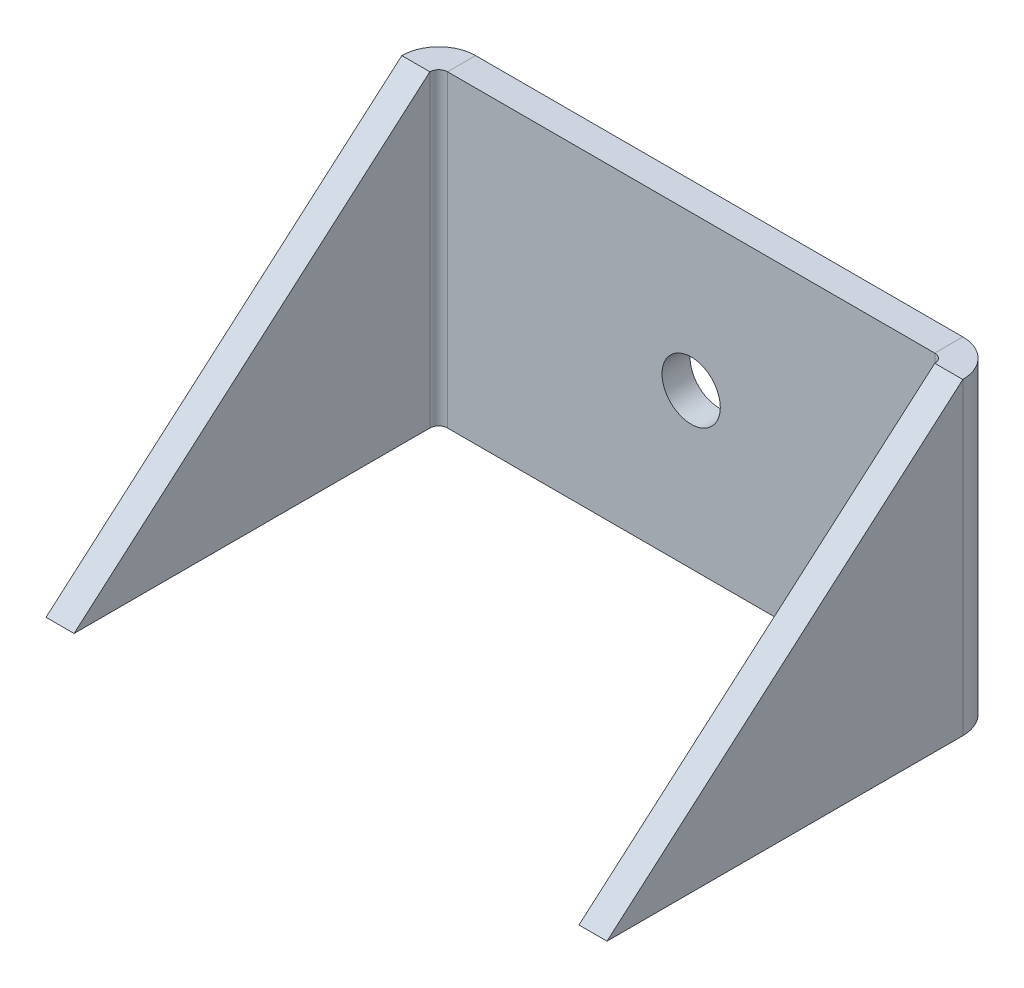
ISO-10303-21;
HEADER;
FILE_DESCRIPTION(('STEP AP214'),'2;1');
FILE_NAME('part.step','',(''),(''),'','','');
FILE_SCHEMA(('AUTOMOTIVE_DESIGN { 1 0 10303 214 1 1 1 1 }'));
ENDSEC;
DATA;
#1=APPLICATION_CONTEXT('core data for automotive mechanical design processes');
#2=APPLICATION_PROTOCOL_DEFINITION('international standard','automotive_design',2000,#1);
#3=PRODUCT_CONTEXT('',#1,'mechanical');
#4=PRODUCT('Part','Part','',(#3));
#5=PRODUCT_RELATED_PRODUCT_CATEGORY('part','',(#4));
#6=PRODUCT_DEFINITION_FORMATION('','',#4);
#7=PRODUCT_DEFINITION_CONTEXT('part definition',#1,'design');
#8=PRODUCT_DEFINITION('design','',#6,#7);
#9=PRODUCT_DEFINITION_SHAPE('','',#8);
#10=(LENGTH_UNIT() NAMED_UNIT(*) SI_UNIT(.MILLI.,.METRE.));
#11=(NAMED_UNIT(*) PLANE_ANGLE_UNIT() SI_UNIT($,.RADIAN.));
#12=(NAMED_UNIT(*) SI_UNIT($,.STERADIAN.) SOLID_ANGLE_UNIT());
#13=UNCERTAINTY_MEASURE_WITH_UNIT(LENGTH_MEASURE(1.E-05),#10,'distance_accuracy_value','');
#14=(GEOMETRIC_REPRESENTATION_CONTEXT(3) GLOBAL_UNCERTAINTY_ASSIGNED_CONTEXT((#13)) GLOBAL_UNIT_ASSIGNED_CONTEXT((#10,
#11,#12)) REPRESENTATION_CONTEXT('',''));
#15=CARTESIAN_POINT('',(0.,0.,0.));
#16=DIRECTION('',(0.,0.,1.));
#17=DIRECTION('',(1.,0.,0.));
#18=AXIS2_PLACEMENT_3D('',#15,#16,#17);
#19=CARTESIAN_POINT('',(-31.75,0.,-1.11966295392247E-13));
#20=DIRECTION('',(1.,0.,0.));
#21=DIRECTION('',(0.,0.,1.));
#22=AXIS2_PLACEMENT_3D('',#19,#20,#21);
#23=PLANE('',#22);
#24=DIRECTION('',(0.,0.655144760280018,-0.755503370659349));
#25=VECTOR('',#24,1.);
#26=CARTESIAN_POINT('',(-31.75,17.4625,4.17499999999998));
#27=LINE('',#26,#25);
#28=CARTESIAN_POINT('',(-31.7500000000001,-17.4625,44.45));
#29=VERTEX_POINT('',#28);
#30=CARTESIAN_POINT('',(-31.75,17.4625,4.17499999999998));
#31=VERTEX_POINT('',#30);
#32=EDGE_CURVE('E125',#29,#31,#27,.T.);
#33=ORIENTED_EDGE('',*,*,#32,.T.);
#34=DIRECTION('',(0.,1.,0.));
#35=VECTOR('',#34,1.);
#36=CARTESIAN_POINT('',(-31.75,0.,4.17499999999998));
#37=LINE('',#36,#35);
#38=CARTESIAN_POINT('',(-31.75,-17.4625,4.17499999999999));
#39=VERTEX_POINT('',#38);
#40=EDGE_CURVE('E148',#39,#31,#37,.T.);
#41=ORIENTED_EDGE('',*,*,#40,.F.);
#42=DIRECTION('',(0.,0.,-1.));
#43=VECTOR('',#42,1.);
#44=CARTESIAN_POINT('',(-31.75,-17.4625,3.17499999999999));
#45=LINE('',#44,#43);
#46=EDGE_CURVE('E154',#29,#39,#45,.T.);
#47=ORIENTED_EDGE('',*,*,#46,.F.);
#48=EDGE_LOOP('',(#33,#41,#47));
#49=FACE_BOUND('',#48,.T.);
#50=ADVANCED_FACE('F35',(#49),#23,.F.);
#51=CARTESIAN_POINT('',(-28.575,0.,-1.0088084214142E-13));
#52=DIRECTION('',(1.,0.,0.));
#53=DIRECTION('',(0.,0.,1.));
#54=AXIS2_PLACEMENT_3D('',#51,#52,#53);
#55=PLANE('',#54);
#56=DIRECTION('',(0.,-1.,0.));
#57=VECTOR('',#56,1.);
#58=CARTESIAN_POINT('',(-28.575,17.4625,4.17499999999999));
#59=LINE('',#58,#57);
#60=CARTESIAN_POINT('',(-28.575,17.4625,4.17499999999999));
#61=VERTEX_POINT('',#60);
#62=CARTESIAN_POINT('',(-28.575,-17.4625,4.175));
#63=VERTEX_POINT('',#62);
#64=EDGE_CURVE('E135',#61,#63,#59,.T.);
#65=ORIENTED_EDGE('',*,*,#64,.F.);
#66=DIRECTION('',(0.,0.655144760280018,-0.755503370659349));
#67=VECTOR('',#66,1.);
#68=CARTESIAN_POINT('',(-28.575,17.4625,4.17499999999999));
#69=LINE('',#68,#67);
#70=CARTESIAN_POINT('',(-28.5750000000001,-17.4625,44.45));
#71=VERTEX_POINT('',#70);
#72=EDGE_CURVE('E114',#71,#61,#69,.T.);
#73=ORIENTED_EDGE('',*,*,#72,.F.);
#74=DIRECTION('',(0.,0.,-1.));
#75=VECTOR('',#74,1.);
#76=CARTESIAN_POINT('',(-28.575,-17.4625,3.175));
#77=LINE('',#76,#75);
#78=EDGE_CURVE('E144',#71,#63,#77,.T.);
#79=ORIENTED_EDGE('',*,*,#78,.T.);
#80=EDGE_LOOP('',(#65,#73,#79));
#81=FACE_BOUND('',#80,.T.);
#82=ADVANCED_FACE('F143',(#81),#55,.T.);
#83=CARTESIAN_POINT('',(-28.575,17.4625,3.175));
#84=DIRECTION('',(0.,-1.,0.));
#85=DIRECTION('',(0.,0.,-1.));
#86=AXIS2_PLACEMENT_3D('',#83,#84,#85);
#87=PLANE('',#86);
#88=DIRECTION('',(0.,0.,-1.));
#89=VECTOR('',#88,1.);
#90=CARTESIAN_POINT('',(-27.575,17.4625,3.175));
#91=LINE('',#90,#89);
#92=CARTESIAN_POINT('',(-27.575,17.4625,3.175));
#93=VERTEX_POINT('',#92);
#94=CARTESIAN_POINT('',(-27.575,17.4625,0.));
#95=VERTEX_POINT('',#94);
#96=EDGE_CURVE('E52',#93,#95,#91,.T.);
#97=ORIENTED_EDGE('',*,*,#96,.F.);
#98=DIRECTION('',(-1.,0.,0.));
#99=VECTOR('',#98,1.);
#100=CARTESIAN_POINT('',(-28.575,17.4625,3.175));
#101=LINE('',#100,#99);
#102=CARTESIAN_POINT('',(27.575,17.4625,3.175));
#103=VERTEX_POINT('',#102);
#104=EDGE_CURVE('E44',#103,#93,#101,.T.);
#105=ORIENTED_EDGE('',*,*,#104,.F.);
#106=DIRECTION('',(0.,0.,-1.));
#107=VECTOR('',#106,1.);
#108=CARTESIAN_POINT('',(27.575,17.4625,3.17499999999999));
#109=LINE('',#108,#107);
#110=CARTESIAN_POINT('',(27.575,17.4625,0.));
#111=VERTEX_POINT('',#110);
#112=EDGE_CURVE('E203',#103,#111,#109,.T.);
#113=ORIENTED_EDGE('',*,*,#112,.T.);
#114=DIRECTION('',(-1.,0.,0.));
#115=VECTOR('',#114,1.);
#116=CARTESIAN_POINT('',(-28.575,17.4625,0.));
#117=LINE('',#116,#115);
#118=EDGE_CURVE('E217',#111,#95,#117,.T.);
#119=ORIENTED_EDGE('',*,*,#118,.T.);
#120=EDGE_LOOP('',(#97,#105,#113,#119));
#121=FACE_BOUND('',#120,.T.);
#122=ADVANCED_FACE('F37',(#121),#87,.F.);
#123=CARTESIAN_POINT('',(-28.575,-17.4625,3.175));
#124=DIRECTION('',(0.,1.,0.));
#125=DIRECTION('',(0.,0.,1.));
#126=AXIS2_PLACEMENT_3D('',#123,#124,#125);
#127=PLANE('',#126);
#128=DIRECTION('',(0.,0.,-1.));
#129=VECTOR('',#128,1.);
#130=CARTESIAN_POINT('',(-27.575,-17.4625,3.175));
#131=LINE('',#130,#129);
#132=CARTESIAN_POINT('',(-27.575,-17.4625,3.175));
#133=VERTEX_POINT('',#132);
#134=CARTESIAN_POINT('',(-27.575,-17.4625,0.));
#135=VERTEX_POINT('',#134);
#136=EDGE_CURVE('E163',#133,#135,#131,.T.);
#137=ORIENTED_EDGE('',*,*,#136,.T.);
#138=DIRECTION('',(1.,0.,0.));
#139=VECTOR('',#138,1.);
#140=CARTESIAN_POINT('',(-28.575,-17.4625,0.));
#141=LINE('',#140,#139);
#142=CARTESIAN_POINT('',(27.575,-17.4625,0.));
#143=VERTEX_POINT('',#142);
#144=EDGE_CURVE('E39',#135,#143,#141,.T.);
#145=ORIENTED_EDGE('',*,*,#144,.T.);
#146=DIRECTION('',(0.,0.,-1.));
#147=VECTOR('',#146,1.);
#148=CARTESIAN_POINT('',(27.575,-17.4625,3.17499999999999));
#149=LINE('',#148,#147);
#150=CARTESIAN_POINT('',(27.575,-17.4625,3.175));
#151=VERTEX_POINT('',#150);
#152=EDGE_CURVE('E214',#151,#143,#149,.T.);
#153=ORIENTED_EDGE('',*,*,#152,.F.);
#154=DIRECTION('',(1.,0.,0.));
#155=VECTOR('',#154,1.);
#156=CARTESIAN_POINT('',(-28.575,-17.4625,3.175));
#157=LINE('',#156,#155);
#158=EDGE_CURVE('E11',#133,#151,#157,.T.);
#159=ORIENTED_EDGE('',*,*,#158,.F.);
#160=EDGE_LOOP('',(#137,#145,#153,#159));
#161=FACE_BOUND('',#160,.T.);
#162=ADVANCED_FACE('F223',(#161),#127,.F.);
#163=CARTESIAN_POINT('',(0.,0.,3.175));
#164=DIRECTION('',(0.,0.,1.));
#165=DIRECTION('',(1.,0.,0.));
#166=AXIS2_PLACEMENT_3D('',#163,#164,#165);
#167=PLANE('',#166);
#168=CARTESIAN_POINT('',(0.,0.,3.175));
#169=DIRECTION('',(0.,0.,1.));
#170=DIRECTION('',(1.,0.,0.));
#171=AXIS2_PLACEMENT_3D('',#168,#169,#170);
#172=CIRCLE('',#171,3.29999999999999);
#173=CARTESIAN_POINT('',(3.29999999999999,0.,3.175));
#174=VERTEX_POINT('',#173);
#175=EDGE_CURVE('E293',#174,#174,#172,.T.);
#176=ORIENTED_EDGE('',*,*,#175,.F.);
#177=EDGE_LOOP('',(#176));
#178=FACE_BOUND('',#177,.T.);
#179=ORIENTED_EDGE('',*,*,#104,.T.);
#180=DIRECTION('',(0.,-1.,0.));
#181=VECTOR('',#180,1.);
#182=CARTESIAN_POINT('',(-27.575,-17.4625,3.175));
#183=LINE('',#182,#181);
#184=EDGE_CURVE('E58',#133,#93,#183,.F.);
#185=ORIENTED_EDGE('',*,*,#184,.F.);
#186=ORIENTED_EDGE('',*,*,#158,.T.);
#187=DIRECTION('',(0.,1.,0.));
#188=VECTOR('',#187,1.);
#189=CARTESIAN_POINT('',(27.575,17.4625,3.17499999999999));
#190=LINE('',#189,#188);
#191=EDGE_CURVE('E209',#103,#151,#190,.F.);
#192=ORIENTED_EDGE('',*,*,#191,.F.);
#193=EDGE_LOOP('',(#179,#185,#186,#192));
#194=FACE_BOUND('',#193,.T.);
#195=ADVANCED_FACE('F255',(#178,#194),#167,.T.);
#196=CARTESIAN_POINT('',(0.,0.,0.));
#197=DIRECTION('',(0.,0.,1.));
#198=DIRECTION('',(1.,0.,0.));
#199=AXIS2_PLACEMENT_3D('',#196,#197,#198);
#200=PLANE('',#199);
#201=CARTESIAN_POINT('',(0.,0.,0.));
#202=DIRECTION('',(0.,0.,1.));
#203=DIRECTION('',(1.,0.,0.));
#204=AXIS2_PLACEMENT_3D('',#201,#202,#203);
#205=CIRCLE('',#204,3.3);
#206=CARTESIAN_POINT('',(3.3,0.,0.));
#207=VERTEX_POINT('',#206);
#208=EDGE_CURVE('E290',#207,#207,#205,.T.);
#209=ORIENTED_EDGE('',*,*,#208,.T.);
#210=EDGE_LOOP('',(#209));
#211=FACE_BOUND('',#210,.T.);
#212=DIRECTION('',(0.,-1.,0.));
#213=VECTOR('',#212,1.);
#214=CARTESIAN_POINT('',(-27.575,-17.4625,0.));
#215=LINE('',#214,#213);
#216=EDGE_CURVE('E160',#135,#95,#215,.F.);
#217=ORIENTED_EDGE('',*,*,#216,.T.);
#218=ORIENTED_EDGE('',*,*,#118,.F.);
#219=DIRECTION('',(0.,1.,0.));
#220=VECTOR('',#219,1.);
#221=CARTESIAN_POINT('',(27.575,17.4625,0.));
#222=LINE('',#221,#220);
#223=EDGE_CURVE('E196',#111,#143,#222,.F.);
#224=ORIENTED_EDGE('',*,*,#223,.T.);
#225=ORIENTED_EDGE('',*,*,#144,.F.);
#226=EDGE_LOOP('',(#217,#218,#224,#225));
#227=FACE_BOUND('',#226,.T.);
#228=ADVANCED_FACE('F228',(#211,#227),#200,.F.);
#229=CARTESIAN_POINT('',(27.575,-17.4625,4.175));
#230=DIRECTION('',(0.,-1.,0.));
#231=DIRECTION('',(0.,0.,-1.));
#232=AXIS2_PLACEMENT_3D('',#229,#230,#231);
#233=PLANE('',#232);
#234=DIRECTION('',(1.,0.,0.));
#235=VECTOR('',#234,1.);
#236=CARTESIAN_POINT('',(28.575,-17.4625,4.17499999999999));
#237=LINE('',#236,#235);
#238=CARTESIAN_POINT('',(28.575,-17.4625,4.17499999999999));
#239=VERTEX_POINT('',#238);
#240=CARTESIAN_POINT('',(31.75,-17.4625,4.17499999999998));
#241=VERTEX_POINT('',#240);
#242=EDGE_CURVE('E174',#239,#241,#237,.T.);
#243=ORIENTED_EDGE('',*,*,#242,.F.);
#244=CARTESIAN_POINT('',(27.575,-17.4625,4.175));
#245=DIRECTION('',(0.,1.,0.));
#246=DIRECTION('',(0.,0.,1.));
#247=AXIS2_PLACEMENT_3D('',#244,#245,#246);
#248=CIRCLE('',#247,1.);
#249=EDGE_CURVE('E206',#151,#239,#248,.F.);
#250=ORIENTED_EDGE('',*,*,#249,.F.);
#251=ORIENTED_EDGE('',*,*,#152,.T.);
#252=CARTESIAN_POINT('',(27.575,-17.4625,4.175));
#253=DIRECTION('',(0.,1.,0.));
#254=DIRECTION('',(0.,0.,1.));
#255=AXIS2_PLACEMENT_3D('',#252,#253,#254);
#256=CIRCLE('',#255,4.175);
#257=EDGE_CURVE('E199',#143,#241,#256,.F.);
#258=ORIENTED_EDGE('',*,*,#257,.T.);
#259=EDGE_LOOP('',(#243,#250,#251,#258));
#260=FACE_BOUND('',#259,.T.);
#261=ADVANCED_FACE('F234',(#260),#233,.T.);
#262=CARTESIAN_POINT('',(27.575,17.4625,4.175));
#263=DIRECTION('',(0.,-1.,0.));
#264=DIRECTION('',(0.,0.,-1.));
#265=AXIS2_PLACEMENT_3D('',#262,#263,#264);
#266=PLANE('',#265);
#267=CARTESIAN_POINT('',(27.575,17.4625,4.175));
#268=DIRECTION('',(0.,1.,0.));
#269=DIRECTION('',(0.,0.,1.));
#270=AXIS2_PLACEMENT_3D('',#267,#268,#269);
#271=CIRCLE('',#270,1.);
#272=CARTESIAN_POINT('',(28.575,17.4625,4.17499999999999));
#273=VERTEX_POINT('',#272);
#274=EDGE_CURVE('E195',#273,#103,#271,.T.);
#275=ORIENTED_EDGE('',*,*,#274,.F.);
#276=DIRECTION('',(1.,0.,0.));
#277=VECTOR('',#276,1.);
#278=CARTESIAN_POINT('',(28.575,17.4625,4.17499999999999));
#279=LINE('',#278,#277);
#280=CARTESIAN_POINT('',(31.75,17.4625,4.17499999999998));
#281=VERTEX_POINT('',#280);
#282=EDGE_CURVE('E179',#273,#281,#279,.T.);
#283=ORIENTED_EDGE('',*,*,#282,.T.);
#284=CARTESIAN_POINT('',(27.575,17.4625,4.175));
#285=DIRECTION('',(0.,1.,0.));
#286=DIRECTION('',(0.,0.,1.));
#287=AXIS2_PLACEMENT_3D('',#284,#285,#286);
#288=CIRCLE('',#287,4.175);
#289=EDGE_CURVE('E200',#281,#111,#288,.T.);
#290=ORIENTED_EDGE('',*,*,#289,.T.);
#291=ORIENTED_EDGE('',*,*,#112,.F.);
#292=EDGE_LOOP('',(#275,#283,#290,#291));
#293=FACE_BOUND('',#292,.T.);
#294=ADVANCED_FACE('F253',(#293),#266,.F.);
#295=CARTESIAN_POINT('',(27.575,17.4625,4.175));
#296=DIRECTION('',(0.,1.,0.));
#297=DIRECTION('',(1.,0.,0.));
#298=AXIS2_PLACEMENT_3D('',#295,#296,#297);
#299=CYLINDRICAL_SURFACE('',#298,4.175);
#300=ORIENTED_EDGE('',*,*,#223,.F.);
#301=ORIENTED_EDGE('',*,*,#289,.F.);
#302=DIRECTION('',(0.,-1.,0.));
#303=VECTOR('',#302,1.);
#304=CARTESIAN_POINT('',(31.75,0.,4.17499999999998));
#305=LINE('',#304,#303);
#306=EDGE_CURVE('E182',#281,#241,#305,.T.);
#307=ORIENTED_EDGE('',*,*,#306,.T.);
#308=ORIENTED_EDGE('',*,*,#257,.F.);
#309=EDGE_LOOP('',(#300,#301,#307,#308));
#310=FACE_BOUND('',#309,.T.);
#311=ADVANCED_FACE('F235',(#310),#299,.T.);
#312=CARTESIAN_POINT('',(27.575,17.4625,4.175));
#313=DIRECTION('',(0.,1.,0.));
#314=DIRECTION('',(1.,0.,0.));
#315=AXIS2_PLACEMENT_3D('',#312,#313,#314);
#316=CYLINDRICAL_SURFACE('',#315,1.);
#317=ORIENTED_EDGE('',*,*,#191,.T.);
#318=ORIENTED_EDGE('',*,*,#249,.T.);
#319=DIRECTION('',(0.,1.,0.));
#320=VECTOR('',#319,1.);
#321=CARTESIAN_POINT('',(28.575,-17.4625,4.17499999999999));
#322=LINE('',#321,#320);
#323=EDGE_CURVE('E176',#239,#273,#322,.T.);
#324=ORIENTED_EDGE('',*,*,#323,.T.);
#325=ORIENTED_EDGE('',*,*,#274,.T.);
#326=EDGE_LOOP('',(#317,#318,#324,#325));
#327=FACE_BOUND('',#326,.T.);
#328=ADVANCED_FACE('F246',(#327),#316,.F.);
#329=CARTESIAN_POINT('',(31.75,-17.4625,3.17499999999999));
#330=DIRECTION('',(0.,1.,0.));
#331=DIRECTION('',(-1.,0.,0.));
#332=AXIS2_PLACEMENT_3D('',#329,#330,#331);
#333=PLANE('',#332);
#334=ORIENTED_EDGE('',*,*,#242,.T.);
#335=DIRECTION('',(0.,0.,-1.));
#336=VECTOR('',#335,1.);
#337=CARTESIAN_POINT('',(31.75,-17.4625,3.17499999999999));
#338=LINE('',#337,#336);
#339=CARTESIAN_POINT('',(31.7500000000001,-17.4625,44.45));
#340=VERTEX_POINT('',#339);
#341=EDGE_CURVE('E187',#340,#241,#338,.T.);
#342=ORIENTED_EDGE('',*,*,#341,.F.);
#343=DIRECTION('',(-1.,0.,0.));
#344=VECTOR('',#343,1.);
#345=CARTESIAN_POINT('',(31.7500000000001,-17.4625,44.45));
#346=LINE('',#345,#344);
#347=CARTESIAN_POINT('',(28.5750000000001,-17.4625,44.45));
#348=VERTEX_POINT('',#347);
#349=EDGE_CURVE('E190',#340,#348,#346,.T.);
#350=ORIENTED_EDGE('',*,*,#349,.T.);
#351=DIRECTION('',(0.,0.,-1.));
#352=VECTOR('',#351,1.);
#353=CARTESIAN_POINT('',(28.575,-17.4625,3.175));
#354=LINE('',#353,#352);
#355=EDGE_CURVE('E186',#348,#239,#354,.T.);
#356=ORIENTED_EDGE('',*,*,#355,.T.);
#357=EDGE_LOOP('',(#334,#342,#350,#356));
#358=FACE_BOUND('',#357,.T.);
#359=ADVANCED_FACE('F242',(#358),#333,.F.);
#360=CARTESIAN_POINT('',(31.75,0.,-1.11966295392247E-13));
#361=DIRECTION('',(-1.,0.,0.));
#362=DIRECTION('',(0.,0.,1.));
#363=AXIS2_PLACEMENT_3D('',#360,#361,#362);
#364=PLANE('',#363);
#365=ORIENTED_EDGE('',*,*,#306,.F.);
#366=DIRECTION('',(0.,0.655144760280018,-0.755503370659349));
#367=VECTOR('',#366,1.);
#368=CARTESIAN_POINT('',(31.75,17.4625,4.17499999999998));
#369=LINE('',#368,#367);
#370=EDGE_CURVE('E169',#340,#281,#369,.T.);
#371=ORIENTED_EDGE('',*,*,#370,.F.);
#372=ORIENTED_EDGE('',*,*,#341,.T.);
#373=EDGE_LOOP('',(#365,#371,#372));
#374=FACE_BOUND('',#373,.T.);
#375=ADVANCED_FACE('F239',(#374),#364,.F.);
#376=CARTESIAN_POINT('',(28.575,0.,-1.0088084214142E-13));
#377=DIRECTION('',(-1.,0.,0.));
#378=DIRECTION('',(0.,0.,1.));
#379=AXIS2_PLACEMENT_3D('',#376,#377,#378);
#380=PLANE('',#379);
#381=DIRECTION('',(0.,0.655144760280018,-0.755503370659349));
#382=VECTOR('',#381,1.);
#383=CARTESIAN_POINT('',(28.575,17.4625,4.17499999999999));
#384=LINE('',#383,#382);
#385=EDGE_CURVE('E171',#348,#273,#384,.T.);
#386=ORIENTED_EDGE('',*,*,#385,.T.);
#387=ORIENTED_EDGE('',*,*,#323,.F.);
#388=ORIENTED_EDGE('',*,*,#355,.F.);
#389=EDGE_LOOP('',(#386,#387,#388));
#390=FACE_BOUND('',#389,.T.);
#391=ADVANCED_FACE('F249',(#390),#380,.T.);
#392=CARTESIAN_POINT('',(28.575,17.4625,4.17499999999999));
#393=DIRECTION('',(0.,-0.755503370659349,-0.655144760280018));
#394=DIRECTION('',(0.,0.655144760280018,-0.755503370659349));
#395=AXIS2_PLACEMENT_3D('',#392,#393,#394);
#396=PLANE('',#395);
#397=ORIENTED_EDGE('',*,*,#370,.T.);
#398=ORIENTED_EDGE('',*,*,#282,.F.);
#399=ORIENTED_EDGE('',*,*,#385,.F.);
#400=ORIENTED_EDGE('',*,*,#349,.F.);
#401=EDGE_LOOP('',(#397,#398,#399,#400));
#402=FACE_BOUND('',#401,.T.);
#403=ADVANCED_FACE('F251',(#402),#396,.F.);
#404=CARTESIAN_POINT('',(-27.575,17.4625,4.175));
#405=DIRECTION('',(0.,1.,0.));
#406=DIRECTION('',(0.,0.,1.));
#407=AXIS2_PLACEMENT_3D('',#404,#405,#406);
#408=PLANE('',#407);
#409=DIRECTION('',(-1.,0.,0.));
#410=VECTOR('',#409,1.);
#411=CARTESIAN_POINT('',(-28.575,17.4625,4.17499999999999));
#412=LINE('',#411,#410);
#413=EDGE_CURVE('E117',#61,#31,#412,.T.);
#414=ORIENTED_EDGE('',*,*,#413,.F.);
#415=CARTESIAN_POINT('',(-27.575,17.4625,4.175));
#416=DIRECTION('',(0.,-1.,0.));
#417=DIRECTION('',(0.,0.,-1.));
#418=AXIS2_PLACEMENT_3D('',#415,#416,#417);
#419=CIRCLE('',#418,0.999999999999997);
#420=EDGE_CURVE('E132',#93,#61,#419,.F.);
#421=ORIENTED_EDGE('',*,*,#420,.F.);
#422=ORIENTED_EDGE('',*,*,#96,.T.);
#423=CARTESIAN_POINT('',(-27.575,17.4625,4.175));
#424=DIRECTION('',(0.,-1.,0.));
#425=DIRECTION('',(0.,0.,-1.));
#426=AXIS2_PLACEMENT_3D('',#423,#424,#425);
#427=CIRCLE('',#426,4.175);
#428=EDGE_CURVE('E134',#95,#31,#427,.F.);
#429=ORIENTED_EDGE('',*,*,#428,.T.);
#430=EDGE_LOOP('',(#414,#421,#422,#429));
#431=FACE_BOUND('',#430,.T.);
#432=ADVANCED_FACE('F131',(#431),#408,.T.);
#433=CARTESIAN_POINT('',(-27.575,-17.4625,4.175));
#434=DIRECTION('',(0.,1.,0.));
#435=DIRECTION('',(0.,0.,1.));
#436=AXIS2_PLACEMENT_3D('',#433,#434,#435);
#437=PLANE('',#436);
#438=CARTESIAN_POINT('',(-27.575,-17.4625,4.175));
#439=DIRECTION('',(0.,-1.,0.));
#440=DIRECTION('',(0.,0.,-1.));
#441=AXIS2_PLACEMENT_3D('',#438,#439,#440);
#442=CIRCLE('',#441,0.999999999999997);
#443=EDGE_CURVE('E159',#63,#133,#442,.T.);
#444=ORIENTED_EDGE('',*,*,#443,.F.);
#445=DIRECTION('',(-1.,0.,0.));
#446=VECTOR('',#445,1.);
#447=CARTESIAN_POINT('',(-28.575,-17.4625,4.175));
#448=LINE('',#447,#446);
#449=EDGE_CURVE('E145',#63,#39,#448,.T.);
#450=ORIENTED_EDGE('',*,*,#449,.T.);
#451=CARTESIAN_POINT('',(-27.575,-17.4625,4.175));
#452=DIRECTION('',(0.,-1.,0.));
#453=DIRECTION('',(0.,0.,-1.));
#454=AXIS2_PLACEMENT_3D('',#451,#452,#453);
#455=CIRCLE('',#454,4.175);
#456=EDGE_CURVE('E141',#39,#135,#455,.T.);
#457=ORIENTED_EDGE('',*,*,#456,.T.);
#458=ORIENTED_EDGE('',*,*,#136,.F.);
#459=EDGE_LOOP('',(#444,#450,#457,#458));
#460=FACE_BOUND('',#459,.T.);
#461=ADVANCED_FACE('F257',(#460),#437,.F.);
#462=CARTESIAN_POINT('',(-27.575,-17.4625,4.175));
#463=DIRECTION('',(0.,-1.,0.));
#464=DIRECTION('',(-1.,0.,0.));
#465=AXIS2_PLACEMENT_3D('',#462,#463,#464);
#466=CYLINDRICAL_SURFACE('',#465,4.175);
#467=ORIENTED_EDGE('',*,*,#216,.F.);
#468=ORIENTED_EDGE('',*,*,#456,.F.);
#469=ORIENTED_EDGE('',*,*,#40,.T.);
#470=ORIENTED_EDGE('',*,*,#428,.F.);
#471=EDGE_LOOP('',(#467,#468,#469,#470));
#472=FACE_BOUND('',#471,.T.);
#473=ADVANCED_FACE('F261',(#472),#466,.T.);
#474=CARTESIAN_POINT('',(-27.575,-17.4625,4.175));
#475=DIRECTION('',(0.,-1.,0.));
#476=DIRECTION('',(-1.,0.,0.));
#477=AXIS2_PLACEMENT_3D('',#474,#475,#476);
#478=CYLINDRICAL_SURFACE('',#477,0.999999999999997);
#479=ORIENTED_EDGE('',*,*,#184,.T.);
#480=ORIENTED_EDGE('',*,*,#420,.T.);
#481=ORIENTED_EDGE('',*,*,#64,.T.);
#482=ORIENTED_EDGE('',*,*,#443,.T.);
#483=EDGE_LOOP('',(#479,#480,#481,#482));
#484=FACE_BOUND('',#483,.T.);
#485=ADVANCED_FACE('F138',(#484),#478,.F.);
#486=CARTESIAN_POINT('',(-31.75,-17.4625,3.17499999999999));
#487=DIRECTION('',(0.,-1.,0.));
#488=DIRECTION('',(1.,0.,0.));
#489=AXIS2_PLACEMENT_3D('',#486,#487,#488);
#490=PLANE('',#489);
#491=ORIENTED_EDGE('',*,*,#46,.T.);
#492=ORIENTED_EDGE('',*,*,#449,.F.);
#493=ORIENTED_EDGE('',*,*,#78,.F.);
#494=DIRECTION('',(1.,0.,0.));
#495=VECTOR('',#494,1.);
#496=CARTESIAN_POINT('',(-31.7500000000001,-17.4625,44.45));
#497=LINE('',#496,#495);
#498=EDGE_CURVE('E120',#29,#71,#497,.T.);
#499=ORIENTED_EDGE('',*,*,#498,.F.);
#500=EDGE_LOOP('',(#491,#492,#493,#499));
#501=FACE_BOUND('',#500,.T.);
#502=ADVANCED_FACE('F265',(#501),#490,.T.);
#503=CARTESIAN_POINT('',(-28.575,17.4625,4.17499999999999));
#504=DIRECTION('',(0.,0.755503370659349,0.655144760280018));
#505=DIRECTION('',(0.,-0.655144760280018,0.755503370659349));
#506=AXIS2_PLACEMENT_3D('',#503,#504,#505);
#507=PLANE('',#506);
#508=ORIENTED_EDGE('',*,*,#32,.F.);
#509=ORIENTED_EDGE('',*,*,#498,.T.);
#510=ORIENTED_EDGE('',*,*,#72,.T.);
#511=ORIENTED_EDGE('',*,*,#413,.T.);
#512=EDGE_LOOP('',(#508,#509,#510,#511));
#513=FACE_BOUND('',#512,.T.);
#514=ADVANCED_FACE('F116',(#513),#507,.T.);
#515=CARTESIAN_POINT('',(0.,0.,3.175));
#516=DIRECTION('',(0.,0.,1.));
#517=DIRECTION('',(1.,0.,0.));
#518=AXIS2_PLACEMENT_3D('',#515,#516,#517);
#519=CYLINDRICAL_SURFACE('',#518,3.29999999999999);
#520=ORIENTED_EDGE('',*,*,#208,.F.);
#521=EDGE_LOOP('',(#520));
#522=FACE_BOUND('',#521,.T.);
#523=ORIENTED_EDGE('',*,*,#175,.T.);
#524=EDGE_LOOP('',(#523));
#525=FACE_BOUND('',#524,.T.);
#526=ADVANCED_FACE('F272',(#522,#525),#519,.F.);
#527=CLOSED_SHELL('',(#50,#82,#122,#162,#195,#228,#261,#294,#311,#328,#359,#375,#391,#403,#432,
#461,#473,#485,#502,#514,#526));
#528=MANIFOLD_SOLID_BREP('B2',#527);
#529=ADVANCED_BREP_SHAPE_REPRESENTATION('',(#18,#528),#14);
#530=SHAPE_DEFINITION_REPRESENTATION(#9,#529);
ENDSEC;
END-ISO-10303-21;
